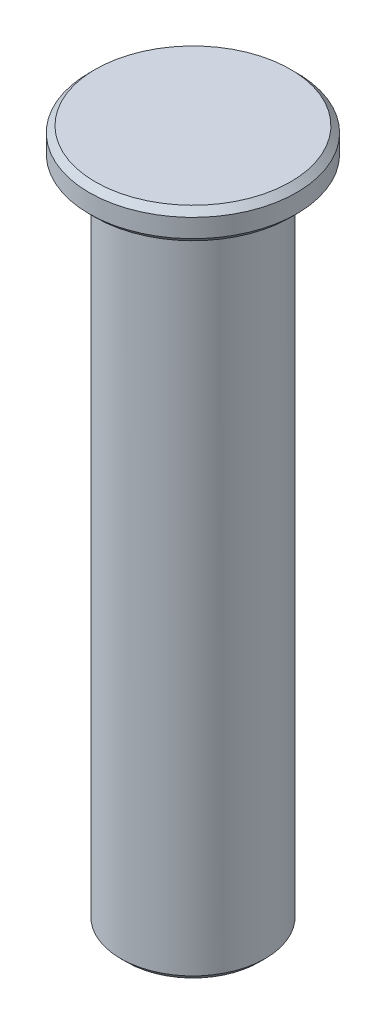
ISO-10303-21;
HEADER;
FILE_DESCRIPTION(('STEP AP214'),'2;1');
FILE_NAME('part.step','',(''),(''),'','','');
FILE_SCHEMA(('AUTOMOTIVE_DESIGN { 1 0 10303 214 1 1 1 1 }'));
ENDSEC;
DATA;
#1=APPLICATION_CONTEXT('core data for automotive mechanical design processes');
#2=APPLICATION_PROTOCOL_DEFINITION('international standard','automotive_design',2000,#1);
#3=PRODUCT_CONTEXT('',#1,'mechanical');
#4=PRODUCT('Part','Part','',(#3));
#5=PRODUCT_RELATED_PRODUCT_CATEGORY('part','',(#4));
#6=PRODUCT_DEFINITION_FORMATION('','',#4);
#7=PRODUCT_DEFINITION_CONTEXT('part definition',#1,'design');
#8=PRODUCT_DEFINITION('design','',#6,#7);
#9=PRODUCT_DEFINITION_SHAPE('','',#8);
#10=(LENGTH_UNIT() NAMED_UNIT(*) SI_UNIT(.MILLI.,.METRE.));
#11=(NAMED_UNIT(*) PLANE_ANGLE_UNIT() SI_UNIT($,.RADIAN.));
#12=(NAMED_UNIT(*) SI_UNIT($,.STERADIAN.) SOLID_ANGLE_UNIT());
#13=UNCERTAINTY_MEASURE_WITH_UNIT(LENGTH_MEASURE(1.E-05),#10,'distance_accuracy_value','');
#14=(GEOMETRIC_REPRESENTATION_CONTEXT(3) GLOBAL_UNCERTAINTY_ASSIGNED_CONTEXT((#13)) GLOBAL_UNIT_ASSIGNED_CONTEXT((#10,
#11,#12)) REPRESENTATION_CONTEXT('',''));
#15=CARTESIAN_POINT('',(0.,0.,0.));
#16=DIRECTION('',(0.,0.,1.));
#17=DIRECTION('',(1.,0.,0.));
#18=AXIS2_PLACEMENT_3D('',#15,#16,#17);
#19=CARTESIAN_POINT('',(0.,45.,0.));
#20=DIRECTION('',(0.,-1.,0.));
#21=DIRECTION('',(0.,0.,-1.));
#22=AXIS2_PLACEMENT_3D('',#19,#20,#21);
#23=CYLINDRICAL_SURFACE('',#22,4.7);
#24=CARTESIAN_POINT('',(0.,0.400000000000039,0.));
#25=DIRECTION('',(0.,1.,0.));
#26=DIRECTION('',(0.,0.,1.));
#27=AXIS2_PLACEMENT_3D('',#24,#25,#26);
#28=CIRCLE('',#27,4.7);
#29=CARTESIAN_POINT('',(0.,0.400000000000032,-4.7));
#30=VERTEX_POINT('',#29);
#31=EDGE_CURVE('E46',#30,#30,#28,.T.);
#32=CARTESIAN_POINT('',(0.,43.,0.));
#33=DIRECTION('',(0.,1.,0.));
#34=DIRECTION('',(0.,0.,1.));
#35=AXIS2_PLACEMENT_3D('',#32,#33,#34);
#36=CIRCLE('',#35,4.7);
#37=CARTESIAN_POINT('',(0.,43.,-4.7));
#38=VERTEX_POINT('',#37);
#39=EDGE_CURVE('E65',#38,#38,#36,.T.);
#40=CARTESIAN_POINT('',(0.,0.400000000000032,-4.7));
#41=CARTESIAN_POINT('',(0.,0.843750000000032,-4.7));
#42=CARTESIAN_POINT('',(0.,1.28750000000003,-4.7));
#43=CARTESIAN_POINT('',(0.,2.17500000000003,-4.7));
#44=CARTESIAN_POINT('',(0.,2.61875000000003,-4.7));
#45=CARTESIAN_POINT('',(0.,3.50625000000003,-4.7));
#46=CARTESIAN_POINT('',(0.,3.95000000000003,-4.7));
#47=CARTESIAN_POINT('',(0.,4.83750000000003,-4.7));
#48=CARTESIAN_POINT('',(0.,5.28125000000003,-4.7));
#49=CARTESIAN_POINT('',(0.,6.16875000000003,-4.7));
#50=CARTESIAN_POINT('',(0.,6.61250000000003,-4.7));
#51=CARTESIAN_POINT('',(0.,7.50000000000003,-4.7));
#52=CARTESIAN_POINT('',(0.,7.94375000000003,-4.7));
#53=CARTESIAN_POINT('',(0.,8.83125000000003,-4.7));
#54=CARTESIAN_POINT('',(0.,9.27500000000003,-4.7));
#55=CARTESIAN_POINT('',(0.,10.1625,-4.7));
#56=CARTESIAN_POINT('',(0.,10.60625,-4.7));
#57=CARTESIAN_POINT('',(0.,11.49375,-4.7));
#58=CARTESIAN_POINT('',(0.,11.9375,-4.7));
#59=CARTESIAN_POINT('',(0.,12.825,-4.7));
#60=CARTESIAN_POINT('',(0.,13.26875,-4.7));
#61=CARTESIAN_POINT('',(0.,14.15625,-4.7));
#62=CARTESIAN_POINT('',(0.,14.6,-4.7));
#63=CARTESIAN_POINT('',(0.,15.4875,-4.7));
#64=CARTESIAN_POINT('',(0.,15.93125,-4.7));
#65=CARTESIAN_POINT('',(0.,16.81875,-4.7));
#66=CARTESIAN_POINT('',(0.,17.2625,-4.7));
#67=CARTESIAN_POINT('',(0.,18.15,-4.7));
#68=CARTESIAN_POINT('',(0.,18.59375,-4.7));
#69=CARTESIAN_POINT('',(0.,19.48125,-4.7));
#70=CARTESIAN_POINT('',(0.,19.925,-4.7));
#71=CARTESIAN_POINT('',(0.,20.8125,-4.7));
#72=CARTESIAN_POINT('',(0.,21.25625,-4.7));
#73=CARTESIAN_POINT('',(0.,22.14375,-4.7));
#74=CARTESIAN_POINT('',(0.,22.5875,-4.7));
#75=CARTESIAN_POINT('',(0.,23.475,-4.7));
#76=CARTESIAN_POINT('',(0.,23.91875,-4.7));
#77=CARTESIAN_POINT('',(0.,24.80625,-4.7));
#78=CARTESIAN_POINT('',(0.,25.25,-4.7));
#79=CARTESIAN_POINT('',(0.,26.1375,-4.7));
#80=CARTESIAN_POINT('',(0.,26.58125,-4.7));
#81=CARTESIAN_POINT('',(0.,27.46875,-4.7));
#82=CARTESIAN_POINT('',(0.,27.9125,-4.7));
#83=CARTESIAN_POINT('',(0.,28.8,-4.7));
#84=CARTESIAN_POINT('',(0.,29.24375,-4.7));
#85=CARTESIAN_POINT('',(0.,30.13125,-4.7));
#86=CARTESIAN_POINT('',(0.,30.575,-4.7));
#87=CARTESIAN_POINT('',(0.,31.4625,-4.7));
#88=CARTESIAN_POINT('',(0.,31.90625,-4.7));
#89=CARTESIAN_POINT('',(0.,32.79375,-4.7));
#90=CARTESIAN_POINT('',(0.,33.2375,-4.7));
#91=CARTESIAN_POINT('',(0.,34.125,-4.7));
#92=CARTESIAN_POINT('',(0.,34.56875,-4.7));
#93=CARTESIAN_POINT('',(0.,35.45625,-4.7));
#94=CARTESIAN_POINT('',(0.,35.9,-4.7));
#95=CARTESIAN_POINT('',(0.,36.7875,-4.7));
#96=CARTESIAN_POINT('',(0.,37.23125,-4.7));
#97=CARTESIAN_POINT('',(0.,38.11875,-4.7));
#98=CARTESIAN_POINT('',(0.,38.5625,-4.7));
#99=CARTESIAN_POINT('',(0.,39.45,-4.7));
#100=CARTESIAN_POINT('',(0.,39.89375,-4.7));
#101=CARTESIAN_POINT('',(0.,40.78125,-4.7));
#102=CARTESIAN_POINT('',(0.,41.225,-4.7));
#103=CARTESIAN_POINT('',(0.,42.1125,-4.7));
#104=CARTESIAN_POINT('',(0.,42.55625,-4.7));
#105=CARTESIAN_POINT('',(0.,43.,-4.7));
#106=B_SPLINE_CURVE_WITH_KNOTS('',3,(#40,#41,#42,#43,#44,#45,#46,#47,#48,#49,#50,#51,#52,#53,
#54,#55,#56,#57,#58,#59,#60,#61,#62,#63,#64,#65,#66,#67,#68,#69,#70,#71,#72,#73,#74,#75,#76,#77,
#78,#79,#80,#81,#82,#83,#84,#85,#86,#87,#88,#89,#90,#91,#92,#93,#94,#95,#96,#97,#98,#99,#100,
#101,#102,#103,#104,#105),.UNSPECIFIED.,.F.,.F.,(4,2,2,2,2,2,2,2,2,2,2,2,2,2,2,2,2,2,2,2,2,2,2,
2,2,2,2,2,2,2,2,2,4),(0.,1.33125,2.6625,3.99375,5.325,6.65625,7.98749999999999,9.31874999999999,
10.65,11.98125,13.3125,14.64375,15.975,17.30625,18.6375,19.96875,21.3,22.63125,23.9625,25.29375,
26.625,27.95625,29.2875,30.61875,31.95,33.28125,34.6125,35.94375,37.275,38.60625,39.9375,
41.26875,42.6),.UNSPECIFIED.);
#107=EDGE_CURVE('BSEAM38',#30,#38,#106,.T.);
#108=ORIENTED_EDGE('',*,*,#31,.T.);
#109=ORIENTED_EDGE('',*,*,#39,.F.);
#110=ORIENTED_EDGE('',*,*,#107,.T.);
#111=ORIENTED_EDGE('',*,*,#107,.F.);
#112=EDGE_LOOP('',(#108,#110,#109,#111));
#113=FACE_BOUND('',#112,.T.);
#114=ADVANCED_FACE('F38',(#113),#23,.T.);
#115=CARTESIAN_POINT('',(0.,0.,0.));
#116=DIRECTION('',(0.,1.,0.));
#117=DIRECTION('',(0.,0.,1.));
#118=AXIS2_PLACEMENT_3D('',#115,#116,#117);
#119=PLANE('',#118);
#120=CARTESIAN_POINT('',(0.,0.,0.));
#121=DIRECTION('',(0.,1.,0.));
#122=DIRECTION('',(0.,0.,1.));
#123=AXIS2_PLACEMENT_3D('',#120,#121,#122);
#124=CIRCLE('',#123,4.29999999999996);
#125=CARTESIAN_POINT('',(0.,0.,4.29999999999996));
#126=VERTEX_POINT('',#125);
#127=EDGE_CURVE('E10',#126,#126,#124,.F.);
#128=ORIENTED_EDGE('',*,*,#127,.T.);
#129=EDGE_LOOP('',(#128));
#130=FACE_BOUND('',#129,.T.);
#131=ADVANCED_FACE('F72',(#130),#119,.F.);
#132=CARTESIAN_POINT('',(0.,43.,0.));
#133=DIRECTION('',(0.,1.,0.));
#134=DIRECTION('',(0.,0.,1.));
#135=AXIS2_PLACEMENT_3D('',#132,#133,#134);
#136=CYLINDRICAL_SURFACE('',#135,6.75);
#137=CARTESIAN_POINT('',(0.,43.4,0.));
#138=DIRECTION('',(0.,1.,0.));
#139=DIRECTION('',(0.,0.,1.));
#140=AXIS2_PLACEMENT_3D('',#137,#138,#139);
#141=CIRCLE('',#140,6.75);
#142=CARTESIAN_POINT('',(0.,43.4,6.75));
#143=VERTEX_POINT('',#142);
#144=EDGE_CURVE('E59',#143,#143,#141,.T.);
#145=ORIENTED_EDGE('',*,*,#144,.T.);
#146=EDGE_LOOP('',(#145));
#147=FACE_BOUND('',#146,.T.);
#148=CARTESIAN_POINT('',(0.,44.6,0.));
#149=DIRECTION('',(0.,1.,0.));
#150=DIRECTION('',(0.,0.,1.));
#151=AXIS2_PLACEMENT_3D('',#148,#149,#150);
#152=CIRCLE('',#151,6.75);
#153=CARTESIAN_POINT('',(0.,44.6,6.75));
#154=VERTEX_POINT('',#153);
#155=EDGE_CURVE('E62',#154,#154,#152,.F.);
#156=ORIENTED_EDGE('',*,*,#155,.T.);
#157=EDGE_LOOP('',(#156));
#158=FACE_BOUND('',#157,.T.);
#159=ADVANCED_FACE('F77',(#147,#158),#136,.T.);
#160=CARTESIAN_POINT('',(0.,43.,0.));
#161=DIRECTION('',(0.,1.,0.));
#162=DIRECTION('',(0.,0.,1.));
#163=AXIS2_PLACEMENT_3D('',#160,#161,#162);
#164=PLANE('',#163);
#165=CARTESIAN_POINT('',(0.,43.,0.));
#166=DIRECTION('',(0.,1.,0.));
#167=DIRECTION('',(0.,0.,1.));
#168=AXIS2_PLACEMENT_3D('',#165,#166,#167);
#169=CIRCLE('',#168,6.35);
#170=CARTESIAN_POINT('',(0.,43.,6.35));
#171=VERTEX_POINT('',#170);
#172=EDGE_CURVE('E54',#171,#171,#169,.F.);
#173=ORIENTED_EDGE('',*,*,#172,.T.);
#174=EDGE_LOOP('',(#173));
#175=FACE_BOUND('',#174,.T.);
#176=ORIENTED_EDGE('',*,*,#39,.T.);
#177=EDGE_LOOP('',(#176));
#178=FACE_BOUND('',#177,.T.);
#179=ADVANCED_FACE('F69',(#175,#178),#164,.F.);
#180=CARTESIAN_POINT('',(0.,45.,0.));
#181=DIRECTION('',(0.,1.,0.));
#182=DIRECTION('',(0.,0.,1.));
#183=AXIS2_PLACEMENT_3D('',#180,#181,#182);
#184=PLANE('',#183);
#185=CARTESIAN_POINT('',(0.,45.,0.));
#186=DIRECTION('',(0.,1.,0.));
#187=DIRECTION('',(0.,0.,1.));
#188=AXIS2_PLACEMENT_3D('',#185,#186,#187);
#189=CIRCLE('',#188,6.35000000000001);
#190=CARTESIAN_POINT('',(0.,45.,6.35000000000001));
#191=VERTEX_POINT('',#190);
#192=EDGE_CURVE('E50',#191,#191,#189,.T.);
#193=ORIENTED_EDGE('',*,*,#192,.T.);
#194=EDGE_LOOP('',(#193));
#195=FACE_BOUND('',#194,.T.);
#196=ADVANCED_FACE('F88',(#195),#184,.T.);
#197=CARTESIAN_POINT('',(0.,43.4,0.));
#198=DIRECTION('',(0.,1.,0.));
#199=DIRECTION('',(0.,0.,1.));
#200=AXIS2_PLACEMENT_3D('',#197,#198,#199);
#201=CONICAL_SURFACE('',#200,6.75,0.785398163397442);
#202=ORIENTED_EDGE('',*,*,#172,.F.);
#203=EDGE_LOOP('',(#202));
#204=FACE_BOUND('',#203,.T.);
#205=ORIENTED_EDGE('',*,*,#144,.F.);
#206=EDGE_LOOP('',(#205));
#207=FACE_BOUND('',#206,.T.);
#208=ADVANCED_FACE('F82',(#204,#207),#201,.T.);
#209=CARTESIAN_POINT('',(0.,45.,0.));
#210=DIRECTION('',(0.,-1.,0.));
#211=DIRECTION('',(0.,0.,-1.));
#212=AXIS2_PLACEMENT_3D('',#209,#210,#211);
#213=CONICAL_SURFACE('',#212,6.35000000000001,0.785398163397449);
#214=ORIENTED_EDGE('',*,*,#155,.F.);
#215=EDGE_LOOP('',(#214));
#216=FACE_BOUND('',#215,.T.);
#217=ORIENTED_EDGE('',*,*,#192,.F.);
#218=EDGE_LOOP('',(#217));
#219=FACE_BOUND('',#218,.T.);
#220=ADVANCED_FACE('F87',(#216,#219),#213,.T.);
#221=CARTESIAN_POINT('',(0.,0.400000000000039,0.));
#222=DIRECTION('',(0.,1.,0.));
#223=DIRECTION('',(0.,0.,1.));
#224=AXIS2_PLACEMENT_3D('',#221,#222,#223);
#225=CONICAL_SURFACE('',#224,4.7,0.785398163397449);
#226=ORIENTED_EDGE('',*,*,#127,.F.);
#227=EDGE_LOOP('',(#226));
#228=FACE_BOUND('',#227,.T.);
#229=ORIENTED_EDGE('',*,*,#31,.F.);
#230=EDGE_LOOP('',(#229));
#231=FACE_BOUND('',#230,.T.);
#232=ADVANCED_FACE('F41',(#228,#231),#225,.T.);
#233=CLOSED_SHELL('',(#114,#131,#159,#179,#196,#208,#220,#232));
#234=MANIFOLD_SOLID_BREP('B2',#233);
#235=ADVANCED_BREP_SHAPE_REPRESENTATION('',(#18,#234),#14);
#236=SHAPE_DEFINITION_REPRESENTATION(#9,#235);
ENDSEC;
END-ISO-10303-21;
